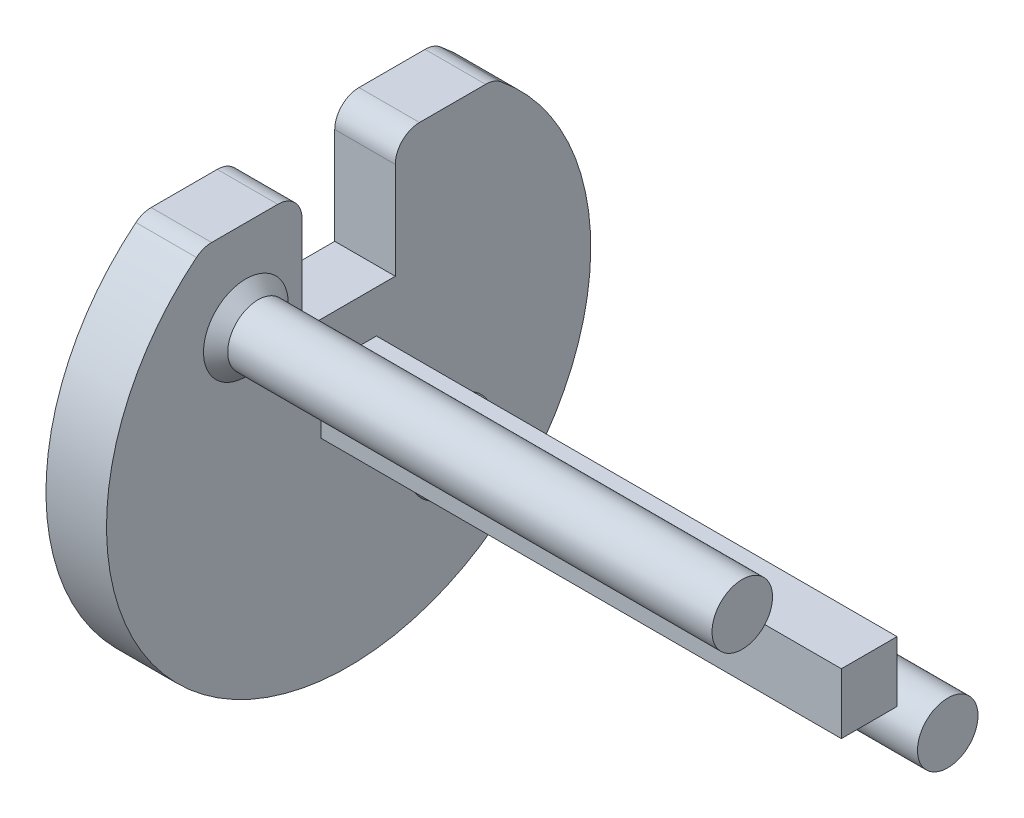
ISO-10303-21;
HEADER;
FILE_DESCRIPTION(('STEP AP214'),'2;1');
FILE_NAME('part.step','',(''),(''),'','','');
FILE_SCHEMA(('AUTOMOTIVE_DESIGN { 1 0 10303 214 1 1 1 1 }'));
ENDSEC;
DATA;
#1=APPLICATION_CONTEXT('core data for automotive mechanical design processes');
#2=APPLICATION_PROTOCOL_DEFINITION('international standard','automotive_design',2000,#1);
#3=PRODUCT_CONTEXT('',#1,'mechanical');
#4=PRODUCT('Part','Part','',(#3));
#5=PRODUCT_RELATED_PRODUCT_CATEGORY('part','',(#4));
#6=PRODUCT_DEFINITION_FORMATION('','',#4);
#7=PRODUCT_DEFINITION_CONTEXT('part definition',#1,'design');
#8=PRODUCT_DEFINITION('design','',#6,#7);
#9=PRODUCT_DEFINITION_SHAPE('','',#8);
#10=(LENGTH_UNIT() NAMED_UNIT(*) SI_UNIT(.MILLI.,.METRE.));
#11=(NAMED_UNIT(*) PLANE_ANGLE_UNIT() SI_UNIT($,.RADIAN.));
#12=(NAMED_UNIT(*) SI_UNIT($,.STERADIAN.) SOLID_ANGLE_UNIT());
#13=UNCERTAINTY_MEASURE_WITH_UNIT(LENGTH_MEASURE(1.E-05),#10,'distance_accuracy_value','');
#14=(GEOMETRIC_REPRESENTATION_CONTEXT(3) GLOBAL_UNCERTAINTY_ASSIGNED_CONTEXT((#13)) GLOBAL_UNIT_ASSIGNED_CONTEXT((#10,
#11,#12)) REPRESENTATION_CONTEXT('',''));
#15=CARTESIAN_POINT('',(0.,0.,0.));
#16=DIRECTION('',(0.,0.,1.));
#17=DIRECTION('',(1.,0.,0.));
#18=AXIS2_PLACEMENT_3D('',#15,#16,#17);
#19=CARTESIAN_POINT('',(48.,2.5,2.5));
#20=DIRECTION('',(0.,-1.,0.));
#21=DIRECTION('',(0.,0.,-1.));
#22=AXIS2_PLACEMENT_3D('',#19,#20,#21);
#23=PLANE('',#22);
#24=DIRECTION('',(-1.,0.,0.));
#25=VECTOR('',#24,1.);
#26=CARTESIAN_POINT('',(48.,2.5,2.3));
#27=LINE('',#26,#25);
#28=CARTESIAN_POINT('',(48.,2.5,2.3));
#29=VERTEX_POINT('',#28);
#30=CARTESIAN_POINT('',(5.,2.5,2.3));
#31=VERTEX_POINT('',#30);
#32=EDGE_CURVE('E165',#29,#31,#27,.T.);
#33=ORIENTED_EDGE('',*,*,#32,.F.);
#34=DIRECTION('',(0.,0.,1.));
#35=VECTOR('',#34,1.);
#36=CARTESIAN_POINT('',(48.,2.5,2.5));
#37=LINE('',#36,#35);
#38=CARTESIAN_POINT('',(48.,2.5,-2.3));
#39=VERTEX_POINT('',#38);
#40=EDGE_CURVE('E177',#39,#29,#37,.T.);
#41=ORIENTED_EDGE('',*,*,#40,.F.);
#42=DIRECTION('',(1.,0.,0.));
#43=VECTOR('',#42,1.);
#44=CARTESIAN_POINT('',(5.,2.5,-2.3));
#45=LINE('',#44,#43);
#46=CARTESIAN_POINT('',(5.,2.5,-2.3));
#47=VERTEX_POINT('',#46);
#48=EDGE_CURVE('E65',#47,#39,#45,.T.);
#49=ORIENTED_EDGE('',*,*,#48,.F.);
#50=DIRECTION('',(0.,0.,1.));
#51=VECTOR('',#50,1.);
#52=CARTESIAN_POINT('',(5.,2.5,2.5));
#53=LINE('',#52,#51);
#54=EDGE_CURVE('E160',#47,#31,#53,.T.);
#55=ORIENTED_EDGE('',*,*,#54,.T.);
#56=EDGE_LOOP('',(#33,#41,#49,#55));
#57=FACE_BOUND('',#56,.T.);
#58=ADVANCED_FACE('F49',(#57),#23,.F.);
#59=CARTESIAN_POINT('',(48.,-2.5,2.5));
#60=DIRECTION('',(0.,1.,0.));
#61=DIRECTION('',(0.,0.,1.));
#62=AXIS2_PLACEMENT_3D('',#59,#60,#61);
#63=PLANE('',#62);
#64=DIRECTION('',(1.,0.,0.));
#65=VECTOR('',#64,1.);
#66=CARTESIAN_POINT('',(5.,-2.5,2.3));
#67=LINE('',#66,#65);
#68=CARTESIAN_POINT('',(5.,-2.5,2.3));
#69=VERTEX_POINT('',#68);
#70=CARTESIAN_POINT('',(48.,-2.5,2.3));
#71=VERTEX_POINT('',#70);
#72=EDGE_CURVE('E164',#69,#71,#67,.T.);
#73=ORIENTED_EDGE('',*,*,#72,.F.);
#74=DIRECTION('',(0.,0.,-1.));
#75=VECTOR('',#74,1.);
#76=CARTESIAN_POINT('',(5.,-2.5,2.5));
#77=LINE('',#76,#75);
#78=CARTESIAN_POINT('',(5.,-2.5,-2.3));
#79=VERTEX_POINT('',#78);
#80=EDGE_CURVE('E161',#69,#79,#77,.T.);
#81=ORIENTED_EDGE('',*,*,#80,.T.);
#82=DIRECTION('',(-1.,0.,0.));
#83=VECTOR('',#82,1.);
#84=CARTESIAN_POINT('',(48.,-2.5,-2.3));
#85=LINE('',#84,#83);
#86=CARTESIAN_POINT('',(48.,-2.5,-2.3));
#87=VERTEX_POINT('',#86);
#88=EDGE_CURVE('E264',#87,#79,#85,.T.);
#89=ORIENTED_EDGE('',*,*,#88,.F.);
#90=DIRECTION('',(0.,0.,-1.));
#91=VECTOR('',#90,1.);
#92=CARTESIAN_POINT('',(48.,-2.5,2.5));
#93=LINE('',#92,#91);
#94=EDGE_CURVE('E183',#71,#87,#93,.T.);
#95=ORIENTED_EDGE('',*,*,#94,.F.);
#96=EDGE_LOOP('',(#73,#81,#89,#95));
#97=FACE_BOUND('',#96,.T.);
#98=ADVANCED_FACE('F267',(#97),#63,.F.);
#99=CARTESIAN_POINT('',(48.,0.,0.));
#100=DIRECTION('',(-1.,0.,0.));
#101=DIRECTION('',(0.,0.,1.));
#102=AXIS2_PLACEMENT_3D('',#99,#100,#101);
#103=PLANE('',#102);
#104=DIRECTION('',(0.,1.,0.));
#105=VECTOR('',#104,1.);
#106=CARTESIAN_POINT('',(48.,-2.5,2.3));
#107=LINE('',#106,#105);
#108=EDGE_CURVE('E170',#71,#29,#107,.T.);
#109=ORIENTED_EDGE('',*,*,#108,.F.);
#110=ORIENTED_EDGE('',*,*,#94,.T.);
#111=DIRECTION('',(0.,-1.,0.));
#112=VECTOR('',#111,1.);
#113=CARTESIAN_POINT('',(48.,2.5,-2.3));
#114=LINE('',#113,#112);
#115=EDGE_CURVE('E259',#39,#87,#114,.T.);
#116=ORIENTED_EDGE('',*,*,#115,.F.);
#117=ORIENTED_EDGE('',*,*,#40,.T.);
#118=EDGE_LOOP('',(#109,#110,#116,#117));
#119=FACE_BOUND('',#118,.T.);
#120=ADVANCED_FACE('F258',(#119),#103,.F.);
#121=CARTESIAN_POINT('',(5.,0.,0.));
#122=DIRECTION('',(1.,0.,0.));
#123=DIRECTION('',(0.,0.,-1.));
#124=AXIS2_PLACEMENT_3D('',#121,#122,#123);
#125=PLANE('',#124);
#126=ORIENTED_EDGE('',*,*,#80,.F.);
#127=DIRECTION('',(0.,-1.,0.));
#128=VECTOR('',#127,1.);
#129=CARTESIAN_POINT('',(5.,2.5,2.3));
#130=LINE('',#129,#128);
#131=EDGE_CURVE('E154',#31,#69,#130,.T.);
#132=ORIENTED_EDGE('',*,*,#131,.F.);
#133=ORIENTED_EDGE('',*,*,#54,.F.);
#134=DIRECTION('',(0.,1.,0.));
#135=VECTOR('',#134,1.);
#136=CARTESIAN_POINT('',(5.,-2.5,-2.3));
#137=LINE('',#136,#135);
#138=EDGE_CURVE('E268',#79,#47,#137,.T.);
#139=ORIENTED_EDGE('',*,*,#138,.F.);
#140=EDGE_LOOP('',(#126,#132,#133,#139));
#141=FACE_BOUND('',#140,.T.);
#142=CARTESIAN_POINT('',(5.,-8.48528137423855,-8.48528137423859));
#143=DIRECTION('',(1.,0.,0.));
#144=DIRECTION('',(0.,0.,-1.));
#145=AXIS2_PLACEMENT_3D('',#142,#143,#144);
#146=CIRCLE('',#145,3.49999999999999);
#147=CARTESIAN_POINT('',(5.,-8.48528137423855,-11.9852813742386));
#148=VERTEX_POINT('',#147);
#149=EDGE_CURVE('E58',#148,#148,#146,.F.);
#150=ORIENTED_EDGE('',*,*,#149,.T.);
#151=EDGE_LOOP('',(#150));
#152=FACE_BOUND('',#151,.T.);
#153=CARTESIAN_POINT('',(5.,8.48528137423856,8.48528137423858));
#154=DIRECTION('',(1.,0.,0.));
#155=DIRECTION('',(0.,0.,-1.));
#156=AXIS2_PLACEMENT_3D('',#153,#154,#155);
#157=CIRCLE('',#156,3.49999999999999);
#158=CARTESIAN_POINT('',(5.,8.48528137423856,4.98528137423859));
#159=VERTEX_POINT('',#158);
#160=EDGE_CURVE('E230',#159,#159,#157,.F.);
#161=ORIENTED_EDGE('',*,*,#160,.T.);
#162=EDGE_LOOP('',(#161));
#163=FACE_BOUND('',#162,.T.);
#164=CARTESIAN_POINT('',(5.,0.,0.));
#165=DIRECTION('',(1.,0.,0.));
#166=DIRECTION('',(0.,0.,-1.));
#167=AXIS2_PLACEMENT_3D('',#164,#165,#166);
#168=CIRCLE('',#167,20.);
#169=CARTESIAN_POINT('',(5.,15.5555555555556,12.5707872210942));
#170=VERTEX_POINT('',#169);
#171=CARTESIAN_POINT('',(5.,15.5555555555556,-12.5707872210942));
#172=VERTEX_POINT('',#171);
#173=EDGE_CURVE('E186',#170,#172,#168,.T.);
#174=ORIENTED_EDGE('',*,*,#173,.T.);
#175=CARTESIAN_POINT('',(5.,14.,-11.3137084989848));
#176=DIRECTION('',(1.,0.,0.));
#177=DIRECTION('',(0.,0.,-1.));
#178=AXIS2_PLACEMENT_3D('',#175,#176,#177);
#179=CIRCLE('',#178,2.);
#180=CARTESIAN_POINT('',(5.,16.,-11.3137084989848));
#181=VERTEX_POINT('',#180);
#182=EDGE_CURVE('E203',#172,#181,#179,.T.);
#183=ORIENTED_EDGE('',*,*,#182,.T.);
#184=DIRECTION('',(0.,0.,-1.));
#185=VECTOR('',#184,1.);
#186=CARTESIAN_POINT('',(5.,16.,0.));
#187=LINE('',#186,#185);
#188=CARTESIAN_POINT('',(5.,16.,-5.85234209844043));
#189=VERTEX_POINT('',#188);
#190=EDGE_CURVE('E278',#189,#181,#187,.T.);
#191=ORIENTED_EDGE('',*,*,#190,.F.);
#192=CARTESIAN_POINT('',(5.,14.,-5.85234209844043));
#193=DIRECTION('',(1.,0.,0.));
#194=DIRECTION('',(0.,0.,-1.));
#195=AXIS2_PLACEMENT_3D('',#192,#193,#194);
#196=CIRCLE('',#195,2.);
#197=CARTESIAN_POINT('',(5.,14.,-3.85234209844043));
#198=VERTEX_POINT('',#197);
#199=EDGE_CURVE('E201',#189,#198,#196,.T.);
#200=ORIENTED_EDGE('',*,*,#199,.T.);
#201=DIRECTION('',(0.,1.,0.));
#202=VECTOR('',#201,1.);
#203=CARTESIAN_POINT('',(5.,0.,-3.85234209844043));
#204=LINE('',#203,#202);
#205=CARTESIAN_POINT('',(5.,6.,-3.85234209844043));
#206=VERTEX_POINT('',#205);
#207=EDGE_CURVE('E297',#206,#198,#204,.T.);
#208=ORIENTED_EDGE('',*,*,#207,.F.);
#209=DIRECTION('',(0.,0.,-1.));
#210=VECTOR('',#209,1.);
#211=CARTESIAN_POINT('',(5.,6.,0.));
#212=LINE('',#211,#210);
#213=CARTESIAN_POINT('',(5.,6.,3.85234209844043));
#214=VERTEX_POINT('',#213);
#215=EDGE_CURVE('E294',#214,#206,#212,.T.);
#216=ORIENTED_EDGE('',*,*,#215,.F.);
#217=DIRECTION('',(0.,1.,0.));
#218=VECTOR('',#217,1.);
#219=CARTESIAN_POINT('',(5.,0.,3.85234209844043));
#220=LINE('',#219,#218);
#221=CARTESIAN_POINT('',(5.,14.,3.85234209844043));
#222=VERTEX_POINT('',#221);
#223=EDGE_CURVE('E291',#214,#222,#220,.T.);
#224=ORIENTED_EDGE('',*,*,#223,.T.);
#225=CARTESIAN_POINT('',(5.,14.,5.85234209844043));
#226=DIRECTION('',(1.,0.,0.));
#227=DIRECTION('',(0.,0.,-1.));
#228=AXIS2_PLACEMENT_3D('',#225,#226,#227);
#229=CIRCLE('',#228,2.);
#230=CARTESIAN_POINT('',(5.,16.,5.85234209844043));
#231=VERTEX_POINT('',#230);
#232=EDGE_CURVE('E199',#222,#231,#229,.T.);
#233=ORIENTED_EDGE('',*,*,#232,.T.);
#234=DIRECTION('',(0.,0.,-1.));
#235=VECTOR('',#234,1.);
#236=CARTESIAN_POINT('',(5.,16.,0.));
#237=LINE('',#236,#235);
#238=CARTESIAN_POINT('',(5.,16.,11.3137084989848));
#239=VERTEX_POINT('',#238);
#240=EDGE_CURVE('E265',#239,#231,#237,.T.);
#241=ORIENTED_EDGE('',*,*,#240,.F.);
#242=CARTESIAN_POINT('',(5.,14.,11.3137084989848));
#243=DIRECTION('',(1.,0.,0.));
#244=DIRECTION('',(0.,0.,-1.));
#245=AXIS2_PLACEMENT_3D('',#242,#243,#244);
#246=CIRCLE('',#245,2.);
#247=EDGE_CURVE('E197',#239,#170,#246,.T.);
#248=ORIENTED_EDGE('',*,*,#247,.T.);
#249=EDGE_LOOP('',(#174,#183,#191,#200,#208,#216,#224,#233,#241,#248));
#250=FACE_BOUND('',#249,.T.);
#251=ADVANCED_FACE('F156',(#141,#152,#163,#250),#125,.T.);
#252=CARTESIAN_POINT('',(5.,0.,0.));
#253=DIRECTION('',(-1.,0.,0.));
#254=DIRECTION('',(0.,0.,1.));
#255=AXIS2_PLACEMENT_3D('',#252,#253,#254);
#256=CYLINDRICAL_SURFACE('',#255,20.);
#257=CARTESIAN_POINT('',(0.,0.,0.));
#258=DIRECTION('',(1.,0.,0.));
#259=DIRECTION('',(0.,0.,-1.));
#260=AXIS2_PLACEMENT_3D('',#257,#258,#259);
#261=CIRCLE('',#260,20.);
#262=CARTESIAN_POINT('',(0.,15.5555555555556,12.5707872210942));
#263=VERTEX_POINT('',#262);
#264=CARTESIAN_POINT('',(0.,15.5555555555556,-12.5707872210942));
#265=VERTEX_POINT('',#264);
#266=EDGE_CURVE('E190',#263,#265,#261,.T.);
#267=ORIENTED_EDGE('',*,*,#266,.T.);
#268=DIRECTION('',(-1.,0.,0.));
#269=VECTOR('',#268,1.);
#270=CARTESIAN_POINT('',(5.,15.5555555555556,-12.5707872210942));
#271=LINE('',#270,#269);
#272=EDGE_CURVE('E194',#265,#172,#271,.F.);
#273=ORIENTED_EDGE('',*,*,#272,.T.);
#274=ORIENTED_EDGE('',*,*,#173,.F.);
#275=DIRECTION('',(-1.,0.,0.));
#276=VECTOR('',#275,1.);
#277=CARTESIAN_POINT('',(5.,15.5555555555556,12.5707872210942));
#278=LINE('',#277,#276);
#279=EDGE_CURVE('E189',#170,#263,#278,.T.);
#280=ORIENTED_EDGE('',*,*,#279,.T.);
#281=EDGE_LOOP('',(#267,#273,#274,#280));
#282=FACE_BOUND('',#281,.T.);
#283=ADVANCED_FACE('F316',(#282),#256,.T.);
#284=CARTESIAN_POINT('',(0.,0.,0.));
#285=DIRECTION('',(1.,0.,0.));
#286=DIRECTION('',(0.,0.,-1.));
#287=AXIS2_PLACEMENT_3D('',#284,#285,#286);
#288=PLANE('',#287);
#289=DIRECTION('',(0.,0.,-1.));
#290=VECTOR('',#289,1.);
#291=CARTESIAN_POINT('',(0.,16.,0.));
#292=LINE('',#291,#290);
#293=CARTESIAN_POINT('',(0.,16.,-5.85234209844043));
#294=VERTEX_POINT('',#293);
#295=CARTESIAN_POINT('',(0.,16.,-11.3137084989848));
#296=VERTEX_POINT('',#295);
#297=EDGE_CURVE('E286',#294,#296,#292,.T.);
#298=ORIENTED_EDGE('',*,*,#297,.T.);
#299=CARTESIAN_POINT('',(0.,14.,-11.3137084989848));
#300=DIRECTION('',(1.,0.,0.));
#301=DIRECTION('',(0.,0.,-1.));
#302=AXIS2_PLACEMENT_3D('',#299,#300,#301);
#303=CIRCLE('',#302,2.);
#304=EDGE_CURVE('E215',#296,#265,#303,.F.);
#305=ORIENTED_EDGE('',*,*,#304,.T.);
#306=ORIENTED_EDGE('',*,*,#266,.F.);
#307=CARTESIAN_POINT('',(0.,14.,11.3137084989848));
#308=DIRECTION('',(1.,0.,0.));
#309=DIRECTION('',(0.,0.,-1.));
#310=AXIS2_PLACEMENT_3D('',#307,#308,#309);
#311=CIRCLE('',#310,2.);
#312=CARTESIAN_POINT('',(0.,16.,11.3137084989848));
#313=VERTEX_POINT('',#312);
#314=EDGE_CURVE('E210',#263,#313,#311,.F.);
#315=ORIENTED_EDGE('',*,*,#314,.T.);
#316=DIRECTION('',(0.,0.,-1.));
#317=VECTOR('',#316,1.);
#318=CARTESIAN_POINT('',(0.,16.,0.));
#319=LINE('',#318,#317);
#320=CARTESIAN_POINT('',(0.,16.,5.85234209844043));
#321=VERTEX_POINT('',#320);
#322=EDGE_CURVE('E275',#313,#321,#319,.T.);
#323=ORIENTED_EDGE('',*,*,#322,.T.);
#324=CARTESIAN_POINT('',(0.,14.,5.85234209844043));
#325=DIRECTION('',(1.,0.,0.));
#326=DIRECTION('',(0.,0.,-1.));
#327=AXIS2_PLACEMENT_3D('',#324,#325,#326);
#328=CIRCLE('',#327,2.);
#329=CARTESIAN_POINT('',(0.,14.,3.85234209844043));
#330=VERTEX_POINT('',#329);
#331=EDGE_CURVE('E73',#321,#330,#328,.F.);
#332=ORIENTED_EDGE('',*,*,#331,.T.);
#333=DIRECTION('',(0.,1.,0.));
#334=VECTOR('',#333,1.);
#335=CARTESIAN_POINT('',(0.,0.,3.85234209844043));
#336=LINE('',#335,#334);
#337=CARTESIAN_POINT('',(0.,6.,3.85234209844043));
#338=VERTEX_POINT('',#337);
#339=EDGE_CURVE('E277',#338,#330,#336,.T.);
#340=ORIENTED_EDGE('',*,*,#339,.F.);
#341=DIRECTION('',(0.,0.,-1.));
#342=VECTOR('',#341,1.);
#343=CARTESIAN_POINT('',(0.,6.,0.));
#344=LINE('',#343,#342);
#345=CARTESIAN_POINT('',(0.,6.,-3.85234209844043));
#346=VERTEX_POINT('',#345);
#347=EDGE_CURVE('E280',#338,#346,#344,.T.);
#348=ORIENTED_EDGE('',*,*,#347,.T.);
#349=DIRECTION('',(0.,1.,0.));
#350=VECTOR('',#349,1.);
#351=CARTESIAN_POINT('',(0.,0.,-3.85234209844043));
#352=LINE('',#351,#350);
#353=CARTESIAN_POINT('',(0.,14.,-3.85234209844043));
#354=VERTEX_POINT('',#353);
#355=EDGE_CURVE('E283',#346,#354,#352,.T.);
#356=ORIENTED_EDGE('',*,*,#355,.T.);
#357=CARTESIAN_POINT('',(0.,14.,-5.85234209844043));
#358=DIRECTION('',(1.,0.,0.));
#359=DIRECTION('',(0.,0.,-1.));
#360=AXIS2_PLACEMENT_3D('',#357,#358,#359);
#361=CIRCLE('',#360,2.);
#362=EDGE_CURVE('E213',#354,#294,#361,.F.);
#363=ORIENTED_EDGE('',*,*,#362,.T.);
#364=EDGE_LOOP('',(#298,#305,#306,#315,#323,#332,#340,#348,#356,#363));
#365=FACE_BOUND('',#364,.T.);
#366=ADVANCED_FACE('F313',(#365),#288,.F.);
#367=CARTESIAN_POINT('',(46.,8.48528137423856,8.48528137423858));
#368=DIRECTION('',(-1.,0.,0.));
#369=DIRECTION('',(0.,0.,1.));
#370=AXIS2_PLACEMENT_3D('',#367,#368,#369);
#371=CYLINDRICAL_SURFACE('',#370,2.5);
#372=CARTESIAN_POINT('',(6.00000000000001,8.48528137423856,8.48528137423858));
#373=DIRECTION('',(1.,0.,0.));
#374=DIRECTION('',(0.,0.,-1.));
#375=AXIS2_PLACEMENT_3D('',#372,#373,#374);
#376=CIRCLE('',#375,2.5);
#377=CARTESIAN_POINT('',(6.00000000000001,8.48528137423856,5.98528137423858));
#378=VERTEX_POINT('',#377);
#379=EDGE_CURVE('E11',#378,#378,#376,.T.);
#380=ORIENTED_EDGE('',*,*,#379,.T.);
#381=EDGE_LOOP('',(#380));
#382=FACE_BOUND('',#381,.T.);
#383=CARTESIAN_POINT('',(46.,8.48528137423856,8.48528137423858));
#384=DIRECTION('',(1.,0.,0.));
#385=DIRECTION('',(0.,0.,-1.));
#386=AXIS2_PLACEMENT_3D('',#383,#384,#385);
#387=CIRCLE('',#386,2.5);
#388=CARTESIAN_POINT('',(46.,8.48528137423856,5.98528137423858));
#389=VERTEX_POINT('',#388);
#390=EDGE_CURVE('E175',#389,#389,#387,.T.);
#391=ORIENTED_EDGE('',*,*,#390,.F.);
#392=EDGE_LOOP('',(#391));
#393=FACE_BOUND('',#392,.T.);
#394=ADVANCED_FACE('F364',(#382,#393),#371,.T.);
#395=CARTESIAN_POINT('',(46.,0.,0.));
#396=DIRECTION('',(1.,0.,0.));
#397=DIRECTION('',(0.,0.,-1.));
#398=AXIS2_PLACEMENT_3D('',#395,#396,#397);
#399=PLANE('',#398);
#400=ORIENTED_EDGE('',*,*,#390,.T.);
#401=EDGE_LOOP('',(#400));
#402=FACE_BOUND('',#401,.T.);
#403=ADVANCED_FACE('F246',(#402),#399,.T.);
#404=CARTESIAN_POINT('',(46.,-8.48528137423855,-8.48528137423859));
#405=DIRECTION('',(-1.,0.,0.));
#406=DIRECTION('',(0.,0.,1.));
#407=AXIS2_PLACEMENT_3D('',#404,#405,#406);
#408=CYLINDRICAL_SURFACE('',#407,2.5);
#409=CARTESIAN_POINT('',(6.00000000000001,-8.48528137423855,-8.48528137423859));
#410=DIRECTION('',(1.,0.,0.));
#411=DIRECTION('',(0.,0.,-1.));
#412=AXIS2_PLACEMENT_3D('',#409,#410,#411);
#413=CIRCLE('',#412,2.5);
#414=CARTESIAN_POINT('',(6.00000000000001,-8.48528137423855,-10.9852813742386));
#415=VERTEX_POINT('',#414);
#416=EDGE_CURVE('E227',#415,#415,#413,.T.);
#417=ORIENTED_EDGE('',*,*,#416,.T.);
#418=EDGE_LOOP('',(#417));
#419=FACE_BOUND('',#418,.T.);
#420=CARTESIAN_POINT('',(46.,-8.48528137423855,-8.48528137423859));
#421=DIRECTION('',(1.,0.,0.));
#422=DIRECTION('',(0.,0.,-1.));
#423=AXIS2_PLACEMENT_3D('',#420,#421,#422);
#424=CIRCLE('',#423,2.5);
#425=CARTESIAN_POINT('',(46.,-8.48528137423855,-10.9852813742386));
#426=VERTEX_POINT('',#425);
#427=EDGE_CURVE('E180',#426,#426,#424,.T.);
#428=ORIENTED_EDGE('',*,*,#427,.F.);
#429=EDGE_LOOP('',(#428));
#430=FACE_BOUND('',#429,.T.);
#431=ADVANCED_FACE('F242',(#419,#430),#408,.T.);
#432=CARTESIAN_POINT('',(46.,0.,0.));
#433=DIRECTION('',(1.,0.,0.));
#434=DIRECTION('',(0.,0.,-1.));
#435=AXIS2_PLACEMENT_3D('',#432,#433,#434);
#436=PLANE('',#435);
#437=ORIENTED_EDGE('',*,*,#427,.T.);
#438=EDGE_LOOP('',(#437));
#439=FACE_BOUND('',#438,.T.);
#440=ADVANCED_FACE('F245',(#439),#436,.T.);
#441=CARTESIAN_POINT('',(0.,16.,0.));
#442=DIRECTION('',(0.,-1.,0.));
#443=DIRECTION('',(0.,0.,-1.));
#444=AXIS2_PLACEMENT_3D('',#441,#442,#443);
#445=PLANE('',#444);
#446=ORIENTED_EDGE('',*,*,#190,.T.);
#447=DIRECTION('',(-1.,0.,0.));
#448=VECTOR('',#447,1.);
#449=CARTESIAN_POINT('',(0.,16.,-11.3137084989848));
#450=LINE('',#449,#448);
#451=EDGE_CURVE('E208',#181,#296,#450,.T.);
#452=ORIENTED_EDGE('',*,*,#451,.T.);
#453=ORIENTED_EDGE('',*,*,#297,.F.);
#454=DIRECTION('',(1.,0.,0.));
#455=VECTOR('',#454,1.);
#456=CARTESIAN_POINT('',(0.,16.,-5.85234209844043));
#457=LINE('',#456,#455);
#458=EDGE_CURVE('E205',#294,#189,#457,.T.);
#459=ORIENTED_EDGE('',*,*,#458,.T.);
#460=EDGE_LOOP('',(#446,#452,#453,#459));
#461=FACE_BOUND('',#460,.T.);
#462=ADVANCED_FACE('F304',(#461),#445,.F.);
#463=CARTESIAN_POINT('',(0.,0.,-3.85234209844043));
#464=DIRECTION('',(0.,0.,-1.));
#465=DIRECTION('',(-1.,0.,0.));
#466=AXIS2_PLACEMENT_3D('',#463,#464,#465);
#467=PLANE('',#466);
#468=ORIENTED_EDGE('',*,*,#207,.T.);
#469=DIRECTION('',(1.,0.,0.));
#470=VECTOR('',#469,1.);
#471=CARTESIAN_POINT('',(0.,14.,-3.85234209844043));
#472=LINE('',#471,#470);
#473=EDGE_CURVE('E217',#198,#354,#472,.F.);
#474=ORIENTED_EDGE('',*,*,#473,.T.);
#475=ORIENTED_EDGE('',*,*,#355,.F.);
#476=DIRECTION('',(1.,0.,0.));
#477=VECTOR('',#476,1.);
#478=CARTESIAN_POINT('',(0.,6.,-3.85234209844043));
#479=LINE('',#478,#477);
#480=EDGE_CURVE('E251',#346,#206,#479,.T.);
#481=ORIENTED_EDGE('',*,*,#480,.T.);
#482=EDGE_LOOP('',(#468,#474,#475,#481));
#483=FACE_BOUND('',#482,.T.);
#484=ADVANCED_FACE('F343',(#483),#467,.F.);
#485=CARTESIAN_POINT('',(0.,6.,0.));
#486=DIRECTION('',(0.,-1.,0.));
#487=DIRECTION('',(0.,0.,-1.));
#488=AXIS2_PLACEMENT_3D('',#485,#486,#487);
#489=PLANE('',#488);
#490=ORIENTED_EDGE('',*,*,#215,.T.);
#491=ORIENTED_EDGE('',*,*,#480,.F.);
#492=ORIENTED_EDGE('',*,*,#347,.F.);
#493=DIRECTION('',(1.,0.,0.));
#494=VECTOR('',#493,1.);
#495=CARTESIAN_POINT('',(0.,6.,3.85234209844043));
#496=LINE('',#495,#494);
#497=EDGE_CURVE('E253',#338,#214,#496,.T.);
#498=ORIENTED_EDGE('',*,*,#497,.T.);
#499=EDGE_LOOP('',(#490,#491,#492,#498));
#500=FACE_BOUND('',#499,.T.);
#501=ADVANCED_FACE('F335',(#500),#489,.F.);
#502=CARTESIAN_POINT('',(0.,0.,3.85234209844043));
#503=DIRECTION('',(0.,0.,-1.));
#504=DIRECTION('',(-1.,0.,0.));
#505=AXIS2_PLACEMENT_3D('',#502,#503,#504);
#506=PLANE('',#505);
#507=ORIENTED_EDGE('',*,*,#339,.T.);
#508=DIRECTION('',(1.,0.,0.));
#509=VECTOR('',#508,1.);
#510=CARTESIAN_POINT('',(5.,14.,3.85234209844043));
#511=LINE('',#510,#509);
#512=EDGE_CURVE('E219',#330,#222,#511,.T.);
#513=ORIENTED_EDGE('',*,*,#512,.T.);
#514=ORIENTED_EDGE('',*,*,#223,.F.);
#515=ORIENTED_EDGE('',*,*,#497,.F.);
#516=EDGE_LOOP('',(#507,#513,#514,#515));
#517=FACE_BOUND('',#516,.T.);
#518=ADVANCED_FACE('F331',(#517),#506,.T.);
#519=CARTESIAN_POINT('',(0.,16.,0.));
#520=DIRECTION('',(0.,-1.,0.));
#521=DIRECTION('',(0.,0.,-1.));
#522=AXIS2_PLACEMENT_3D('',#519,#520,#521);
#523=PLANE('',#522);
#524=ORIENTED_EDGE('',*,*,#240,.T.);
#525=DIRECTION('',(1.,0.,0.));
#526=VECTOR('',#525,1.);
#527=CARTESIAN_POINT('',(0.,16.,5.85234209844043));
#528=LINE('',#527,#526);
#529=EDGE_CURVE('E225',#231,#321,#528,.F.);
#530=ORIENTED_EDGE('',*,*,#529,.T.);
#531=ORIENTED_EDGE('',*,*,#322,.F.);
#532=DIRECTION('',(-1.,0.,0.));
#533=VECTOR('',#532,1.);
#534=CARTESIAN_POINT('',(0.,16.,11.3137084989848));
#535=LINE('',#534,#533);
#536=EDGE_CURVE('E222',#313,#239,#535,.F.);
#537=ORIENTED_EDGE('',*,*,#536,.T.);
#538=EDGE_LOOP('',(#524,#530,#531,#537));
#539=FACE_BOUND('',#538,.T.);
#540=ADVANCED_FACE('F323',(#539),#523,.F.);
#541=CARTESIAN_POINT('',(5.,14.,-11.3137084989848));
#542=DIRECTION('',(-1.,0.,0.));
#543=DIRECTION('',(0.,0.,1.));
#544=AXIS2_PLACEMENT_3D('',#541,#542,#543);
#545=CYLINDRICAL_SURFACE('',#544,2.);
#546=ORIENTED_EDGE('',*,*,#304,.F.);
#547=ORIENTED_EDGE('',*,*,#451,.F.);
#548=ORIENTED_EDGE('',*,*,#182,.F.);
#549=ORIENTED_EDGE('',*,*,#272,.F.);
#550=EDGE_LOOP('',(#546,#547,#548,#549));
#551=FACE_BOUND('',#550,.T.);
#552=ADVANCED_FACE('F310',(#551),#545,.T.);
#553=CARTESIAN_POINT('',(0.,14.,-5.85234209844043));
#554=DIRECTION('',(1.,0.,0.));
#555=DIRECTION('',(0.,0.,-1.));
#556=AXIS2_PLACEMENT_3D('',#553,#554,#555);
#557=CYLINDRICAL_SURFACE('',#556,2.);
#558=ORIENTED_EDGE('',*,*,#362,.F.);
#559=ORIENTED_EDGE('',*,*,#473,.F.);
#560=ORIENTED_EDGE('',*,*,#199,.F.);
#561=ORIENTED_EDGE('',*,*,#458,.F.);
#562=EDGE_LOOP('',(#558,#559,#560,#561));
#563=FACE_BOUND('',#562,.T.);
#564=ADVANCED_FACE('F342',(#563),#557,.T.);
#565=CARTESIAN_POINT('',(0.,14.,5.85234209844043));
#566=DIRECTION('',(-1.,0.,0.));
#567=DIRECTION('',(0.,0.,1.));
#568=AXIS2_PLACEMENT_3D('',#565,#566,#567);
#569=CYLINDRICAL_SURFACE('',#568,2.);
#570=ORIENTED_EDGE('',*,*,#331,.F.);
#571=ORIENTED_EDGE('',*,*,#529,.F.);
#572=ORIENTED_EDGE('',*,*,#232,.F.);
#573=ORIENTED_EDGE('',*,*,#512,.F.);
#574=EDGE_LOOP('',(#570,#571,#572,#573));
#575=FACE_BOUND('',#574,.T.);
#576=ADVANCED_FACE('F327',(#575),#569,.T.);
#577=CARTESIAN_POINT('',(5.,14.,11.3137084989848));
#578=DIRECTION('',(-1.,0.,0.));
#579=DIRECTION('',(0.,0.,1.));
#580=AXIS2_PLACEMENT_3D('',#577,#578,#579);
#581=CYLINDRICAL_SURFACE('',#580,2.);
#582=ORIENTED_EDGE('',*,*,#314,.F.);
#583=ORIENTED_EDGE('',*,*,#279,.F.);
#584=ORIENTED_EDGE('',*,*,#247,.F.);
#585=ORIENTED_EDGE('',*,*,#536,.F.);
#586=EDGE_LOOP('',(#582,#583,#584,#585));
#587=FACE_BOUND('',#586,.T.);
#588=ADVANCED_FACE('F239',(#587),#581,.T.);
#589=CARTESIAN_POINT('',(6.00000000000001,-8.48528137423855,-8.48528137423859));
#590=DIRECTION('',(-1.,0.,0.));
#591=DIRECTION('',(0.,0.,1.));
#592=AXIS2_PLACEMENT_3D('',#589,#590,#591);
#593=CONICAL_SURFACE('',#592,2.5,0.785398163397439);
#594=ORIENTED_EDGE('',*,*,#149,.F.);
#595=EDGE_LOOP('',(#594));
#596=FACE_BOUND('',#595,.T.);
#597=ORIENTED_EDGE('',*,*,#416,.F.);
#598=EDGE_LOOP('',(#597));
#599=FACE_BOUND('',#598,.T.);
#600=ADVANCED_FACE('F236',(#596,#599),#593,.T.);
#601=CARTESIAN_POINT('',(6.00000000000001,8.48528137423856,8.48528137423858));
#602=DIRECTION('',(-1.,0.,0.));
#603=DIRECTION('',(0.,0.,1.));
#604=AXIS2_PLACEMENT_3D('',#601,#602,#603);
#605=CONICAL_SURFACE('',#604,2.5,0.785398163397439);
#606=ORIENTED_EDGE('',*,*,#160,.F.);
#607=EDGE_LOOP('',(#606));
#608=FACE_BOUND('',#607,.T.);
#609=ORIENTED_EDGE('',*,*,#379,.F.);
#610=EDGE_LOOP('',(#609));
#611=FACE_BOUND('',#610,.T.);
#612=ADVANCED_FACE('F52',(#608,#611),#605,.T.);
#613=CARTESIAN_POINT('',(0.,0.,-2.3));
#614=DIRECTION('',(0.,0.,-1.));
#615=DIRECTION('',(-1.,0.,0.));
#616=AXIS2_PLACEMENT_3D('',#613,#614,#615);
#617=PLANE('',#616);
#618=ORIENTED_EDGE('',*,*,#88,.T.);
#619=ORIENTED_EDGE('',*,*,#138,.T.);
#620=ORIENTED_EDGE('',*,*,#48,.T.);
#621=ORIENTED_EDGE('',*,*,#115,.T.);
#622=EDGE_LOOP('',(#618,#619,#620,#621));
#623=FACE_BOUND('',#622,.T.);
#624=ADVANCED_FACE('F263',(#623),#617,.T.);
#625=CARTESIAN_POINT('',(0.,0.,2.3));
#626=DIRECTION('',(0.,0.,1.));
#627=DIRECTION('',(1.,0.,0.));
#628=AXIS2_PLACEMENT_3D('',#625,#626,#627);
#629=PLANE('',#628);
#630=ORIENTED_EDGE('',*,*,#32,.T.);
#631=ORIENTED_EDGE('',*,*,#131,.T.);
#632=ORIENTED_EDGE('',*,*,#72,.T.);
#633=ORIENTED_EDGE('',*,*,#108,.T.);
#634=EDGE_LOOP('',(#630,#631,#632,#633));
#635=FACE_BOUND('',#634,.T.);
#636=ADVANCED_FACE('F168',(#635),#629,.T.);
#637=CLOSED_SHELL('',(#58,#98,#120,#251,#283,#366,#394,#403,#431,#440,#462,#484,#501,#518,#540,
#552,#564,#576,#588,#600,#612,#624,#636));
#638=MANIFOLD_SOLID_BREP('B2',#637);
#639=ADVANCED_BREP_SHAPE_REPRESENTATION('',(#18,#638),#14);
#640=SHAPE_DEFINITION_REPRESENTATION(#9,#639);
ENDSEC;
END-ISO-10303-21;
